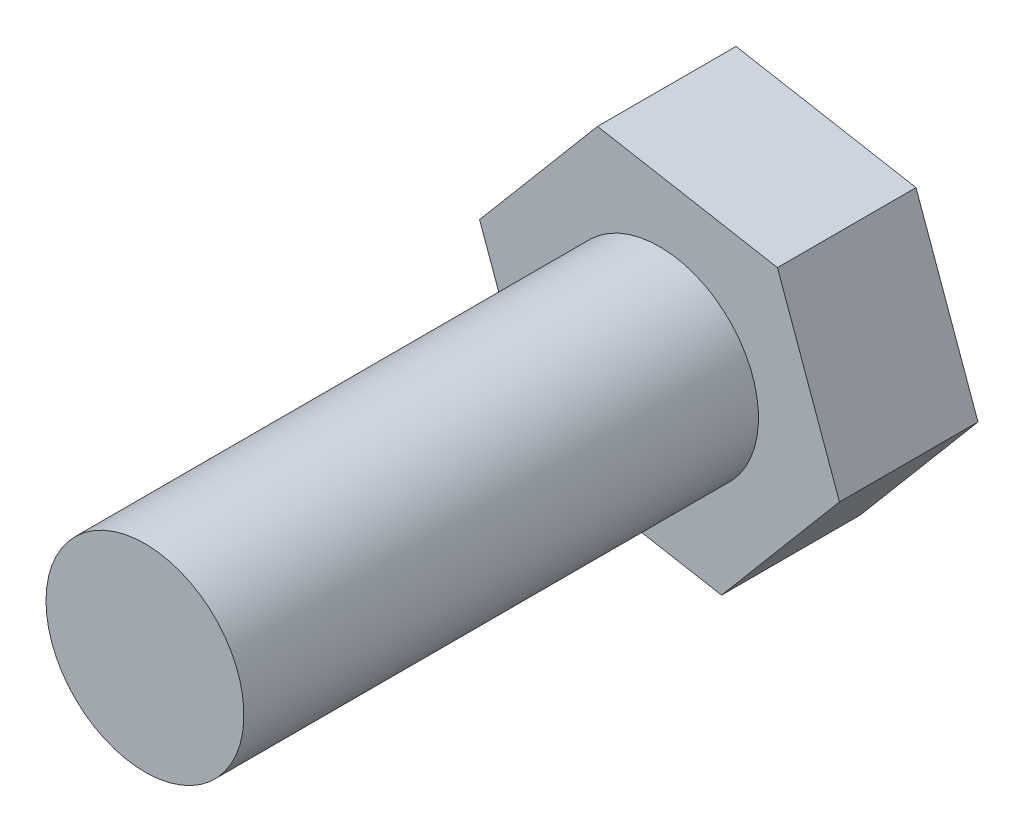
ISO-10303-21;
HEADER;
FILE_DESCRIPTION(('STEP AP214'),'2;1');
FILE_NAME('part.step','',(''),(''),'','','');
FILE_SCHEMA(('AUTOMOTIVE_DESIGN { 1 0 10303 214 1 1 1 1 }'));
ENDSEC;
DATA;
#1=APPLICATION_CONTEXT('core data for automotive mechanical design processes');
#2=APPLICATION_PROTOCOL_DEFINITION('international standard','automotive_design',2000,#1);
#3=PRODUCT_CONTEXT('',#1,'mechanical');
#4=PRODUCT('Part','Part','',(#3));
#5=PRODUCT_RELATED_PRODUCT_CATEGORY('part','',(#4));
#6=PRODUCT_DEFINITION_FORMATION('','',#4);
#7=PRODUCT_DEFINITION_CONTEXT('part definition',#1,'design');
#8=PRODUCT_DEFINITION('design','',#6,#7);
#9=PRODUCT_DEFINITION_SHAPE('','',#8);
#10=(LENGTH_UNIT() NAMED_UNIT(*) SI_UNIT(.MILLI.,.METRE.));
#11=(NAMED_UNIT(*) PLANE_ANGLE_UNIT() SI_UNIT($,.RADIAN.));
#12=(NAMED_UNIT(*) SI_UNIT($,.STERADIAN.) SOLID_ANGLE_UNIT());
#13=UNCERTAINTY_MEASURE_WITH_UNIT(LENGTH_MEASURE(1.E-05),#10,'distance_accuracy_value','');
#14=(GEOMETRIC_REPRESENTATION_CONTEXT(3) GLOBAL_UNCERTAINTY_ASSIGNED_CONTEXT((#13)) GLOBAL_UNIT_ASSIGNED_CONTEXT((#10,
#11,#12)) REPRESENTATION_CONTEXT('',''));
#15=CARTESIAN_POINT('',(0.,0.,0.));
#16=DIRECTION('',(0.,0.,1.));
#17=DIRECTION('',(1.,0.,0.));
#18=AXIS2_PLACEMENT_3D('',#15,#16,#17);
#19=CARTESIAN_POINT('',(0.,0.,3.5));
#20=DIRECTION('',(0.,0.,1.));
#21=DIRECTION('',(1.,0.,0.));
#22=AXIS2_PLACEMENT_3D('',#19,#20,#21);
#23=PLANE('',#22);
#24=DIRECTION('',(0.339123555075527,-0.940741842586443,0.));
#25=VECTOR('',#24,1.);
#26=CARTESIAN_POINT('',(-4.54613967359137,0.816056003918801,3.5));
#27=LINE('',#26,#25);
#28=CARTESIAN_POINT('',(-4.54613967359137,0.816056003918801,3.5));
#29=VERTEX_POINT('',#28);
#30=CARTESIAN_POINT('',(-2.97979506710018,-3.52904444452302,3.5));
#31=VERTEX_POINT('',#30);
#32=EDGE_CURVE('E132',#29,#31,#27,.T.);
#33=ORIENTED_EDGE('',*,*,#32,.T.);
#34=DIRECTION('',(0.984268111620605,-0.176681307576124,0.));
#35=VECTOR('',#34,1.);
#36=CARTESIAN_POINT('',(-2.97979506710018,-3.52904444452302,3.5));
#37=LINE('',#36,#35);
#38=CARTESIAN_POINT('',(1.56634460649119,-4.34510044844182,3.5));
#39=VERTEX_POINT('',#38);
#40=EDGE_CURVE('E90',#31,#39,#37,.T.);
#41=ORIENTED_EDGE('',*,*,#40,.T.);
#42=DIRECTION('',(0.645144556545077,0.764060535010319,0.));
#43=VECTOR('',#42,1.);
#44=CARTESIAN_POINT('',(1.56634460649119,-4.34510044844182,3.5));
#45=LINE('',#44,#43);
#46=CARTESIAN_POINT('',(4.54613967359137,-0.816056003918799,3.5));
#47=VERTEX_POINT('',#46);
#48=EDGE_CURVE('E103',#39,#47,#45,.T.);
#49=ORIENTED_EDGE('',*,*,#48,.T.);
#50=DIRECTION('',(-0.339123555075527,0.940741842586443,0.));
#51=VECTOR('',#50,1.);
#52=CARTESIAN_POINT('',(4.54613967359137,-0.816056003918799,3.5));
#53=LINE('',#52,#51);
#54=CARTESIAN_POINT('',(2.97979506710018,3.52904444452302,3.5));
#55=VERTEX_POINT('',#54);
#56=EDGE_CURVE('E97',#47,#55,#53,.T.);
#57=ORIENTED_EDGE('',*,*,#56,.T.);
#58=DIRECTION('',(-0.984268111620605,0.176681307576124,0.));
#59=VECTOR('',#58,1.);
#60=CARTESIAN_POINT('',(2.97979506710018,3.52904444452302,3.5));
#61=LINE('',#60,#59);
#62=CARTESIAN_POINT('',(-1.56634460649119,4.34510044844182,3.5));
#63=VERTEX_POINT('',#62);
#64=EDGE_CURVE('E101',#55,#63,#61,.T.);
#65=ORIENTED_EDGE('',*,*,#64,.T.);
#66=DIRECTION('',(-0.645144556545078,-0.764060535010319,0.));
#67=VECTOR('',#66,1.);
#68=CARTESIAN_POINT('',(-1.56634460649119,4.34510044844182,3.5));
#69=LINE('',#68,#67);
#70=EDGE_CURVE('E53',#63,#29,#69,.T.);
#71=ORIENTED_EDGE('',*,*,#70,.T.);
#72=EDGE_LOOP('',(#33,#41,#49,#57,#65,#71));
#73=FACE_BOUND('',#72,.T.);
#74=CARTESIAN_POINT('',(0.,0.,3.5));
#75=DIRECTION('',(0.,0.,1.));
#76=DIRECTION('',(1.,0.,0.));
#77=AXIS2_PLACEMENT_3D('',#74,#75,#76);
#78=CIRCLE('',#77,2.5);
#79=CARTESIAN_POINT('',(-2.5,0.,3.5));
#80=VERTEX_POINT('',#79);
#81=EDGE_CURVE('E172',#80,#80,#78,.T.);
#82=ORIENTED_EDGE('',*,*,#81,.F.);
#83=EDGE_LOOP('',(#82));
#84=FACE_BOUND('',#83,.T.);
#85=ADVANCED_FACE('F36',(#73,#84),#23,.T.);
#86=CARTESIAN_POINT('',(-4.54613967359137,0.816056003918801,3.5));
#87=DIRECTION('',(0.940741842586443,0.339123555075527,0.));
#88=DIRECTION('',(-0.339123555075527,0.940741842586443,0.));
#89=AXIS2_PLACEMENT_3D('',#86,#87,#88);
#90=PLANE('',#89);
#91=DIRECTION('',(0.339123555075527,-0.940741842586443,0.));
#92=VECTOR('',#91,1.);
#93=CARTESIAN_POINT('',(-4.54613967359137,0.816056003918801,0.));
#94=LINE('',#93,#92);
#95=CARTESIAN_POINT('',(-4.54613967359137,0.816056003918801,0.));
#96=VERTEX_POINT('',#95);
#97=CARTESIAN_POINT('',(-2.97979506710018,-3.52904444452302,0.));
#98=VERTEX_POINT('',#97);
#99=EDGE_CURVE('E121',#96,#98,#94,.T.);
#100=ORIENTED_EDGE('',*,*,#99,.T.);
#101=DIRECTION('',(0.,0.,-1.));
#102=VECTOR('',#101,1.);
#103=CARTESIAN_POINT('',(-2.97979506710018,-3.52904444452302,3.5));
#104=LINE('',#103,#102);
#105=EDGE_CURVE('E11',#31,#98,#104,.T.);
#106=ORIENTED_EDGE('',*,*,#105,.F.);
#107=ORIENTED_EDGE('',*,*,#32,.F.);
#108=DIRECTION('',(0.,0.,-1.));
#109=VECTOR('',#108,1.);
#110=CARTESIAN_POINT('',(-4.54613967359137,0.816056003918801,3.5));
#111=LINE('',#110,#109);
#112=EDGE_CURVE('E117',#29,#96,#111,.T.);
#113=ORIENTED_EDGE('',*,*,#112,.T.);
#114=EDGE_LOOP('',(#100,#106,#107,#113));
#115=FACE_BOUND('',#114,.T.);
#116=ADVANCED_FACE('F38',(#115),#90,.F.);
#117=CARTESIAN_POINT('',(-2.97979506710018,-3.52904444452302,3.5));
#118=DIRECTION('',(0.176681307576124,0.984268111620605,0.));
#119=DIRECTION('',(-0.984268111620605,0.176681307576124,0.));
#120=AXIS2_PLACEMENT_3D('',#117,#118,#119);
#121=PLANE('',#120);
#122=DIRECTION('',(0.984268111620605,-0.176681307576124,0.));
#123=VECTOR('',#122,1.);
#124=CARTESIAN_POINT('',(-2.97979506710018,-3.52904444452302,0.));
#125=LINE('',#124,#123);
#126=CARTESIAN_POINT('',(1.56634460649119,-4.34510044844182,0.));
#127=VERTEX_POINT('',#126);
#128=EDGE_CURVE('E124',#98,#127,#125,.T.);
#129=ORIENTED_EDGE('',*,*,#128,.T.);
#130=DIRECTION('',(0.,0.,-1.));
#131=VECTOR('',#130,1.);
#132=CARTESIAN_POINT('',(1.56634460649119,-4.34510044844182,3.5));
#133=LINE('',#132,#131);
#134=EDGE_CURVE('E45',#39,#127,#133,.T.);
#135=ORIENTED_EDGE('',*,*,#134,.F.);
#136=ORIENTED_EDGE('',*,*,#40,.F.);
#137=ORIENTED_EDGE('',*,*,#105,.T.);
#138=EDGE_LOOP('',(#129,#135,#136,#137));
#139=FACE_BOUND('',#138,.T.);
#140=ADVANCED_FACE('F160',(#139),#121,.F.);
#141=CARTESIAN_POINT('',(1.56634460649119,-4.34510044844182,3.5));
#142=DIRECTION('',(-0.764060535010319,0.645144556545077,0.));
#143=DIRECTION('',(-0.645144556545078,-0.764060535010319,0.));
#144=AXIS2_PLACEMENT_3D('',#141,#142,#143);
#145=PLANE('',#144);
#146=DIRECTION('',(0.645144556545077,0.764060535010319,0.));
#147=VECTOR('',#146,1.);
#148=CARTESIAN_POINT('',(1.56634460649119,-4.34510044844182,0.));
#149=LINE('',#148,#147);
#150=CARTESIAN_POINT('',(4.54613967359137,-0.816056003918799,0.));
#151=VERTEX_POINT('',#150);
#152=EDGE_CURVE('E127',#127,#151,#149,.T.);
#153=ORIENTED_EDGE('',*,*,#152,.T.);
#154=DIRECTION('',(0.,0.,-1.));
#155=VECTOR('',#154,1.);
#156=CARTESIAN_POINT('',(4.54613967359137,-0.816056003918799,3.5));
#157=LINE('',#156,#155);
#158=EDGE_CURVE('E112',#47,#151,#157,.T.);
#159=ORIENTED_EDGE('',*,*,#158,.F.);
#160=ORIENTED_EDGE('',*,*,#48,.F.);
#161=ORIENTED_EDGE('',*,*,#134,.T.);
#162=EDGE_LOOP('',(#153,#159,#160,#161));
#163=FACE_BOUND('',#162,.T.);
#164=ADVANCED_FACE('F138',(#163),#145,.F.);
#165=CARTESIAN_POINT('',(4.54613967359137,-0.816056003918799,3.5));
#166=DIRECTION('',(-0.940741842586443,-0.339123555075527,0.));
#167=DIRECTION('',(0.339123555075527,-0.940741842586443,0.));
#168=AXIS2_PLACEMENT_3D('',#165,#166,#167);
#169=PLANE('',#168);
#170=DIRECTION('',(-0.339123555075527,0.940741842586443,0.));
#171=VECTOR('',#170,1.);
#172=CARTESIAN_POINT('',(4.54613967359137,-0.816056003918799,0.));
#173=LINE('',#172,#171);
#174=CARTESIAN_POINT('',(2.97979506710018,3.52904444452302,0.));
#175=VERTEX_POINT('',#174);
#176=EDGE_CURVE('E111',#151,#175,#173,.T.);
#177=ORIENTED_EDGE('',*,*,#176,.T.);
#178=DIRECTION('',(0.,0.,-1.));
#179=VECTOR('',#178,1.);
#180=CARTESIAN_POINT('',(2.97979506710018,3.52904444452302,3.5));
#181=LINE('',#180,#179);
#182=EDGE_CURVE('E108',#55,#175,#181,.T.);
#183=ORIENTED_EDGE('',*,*,#182,.F.);
#184=ORIENTED_EDGE('',*,*,#56,.F.);
#185=ORIENTED_EDGE('',*,*,#158,.T.);
#186=EDGE_LOOP('',(#177,#183,#184,#185));
#187=FACE_BOUND('',#186,.T.);
#188=ADVANCED_FACE('F109',(#187),#169,.F.);
#189=CARTESIAN_POINT('',(2.97979506710018,3.52904444452302,3.5));
#190=DIRECTION('',(-0.176681307576124,-0.984268111620605,0.));
#191=DIRECTION('',(0.984268111620605,-0.176681307576124,0.));
#192=AXIS2_PLACEMENT_3D('',#189,#190,#191);
#193=PLANE('',#192);
#194=DIRECTION('',(-0.984268111620605,0.176681307576124,0.));
#195=VECTOR('',#194,1.);
#196=CARTESIAN_POINT('',(2.97979506710018,3.52904444452302,0.));
#197=LINE('',#196,#195);
#198=CARTESIAN_POINT('',(-1.56634460649119,4.34510044844182,0.));
#199=VERTEX_POINT('',#198);
#200=EDGE_CURVE('E76',#175,#199,#197,.T.);
#201=ORIENTED_EDGE('',*,*,#200,.T.);
#202=DIRECTION('',(0.,0.,-1.));
#203=VECTOR('',#202,1.);
#204=CARTESIAN_POINT('',(-1.56634460649119,4.34510044844182,3.5));
#205=LINE('',#204,#203);
#206=EDGE_CURVE('E113',#63,#199,#205,.T.);
#207=ORIENTED_EDGE('',*,*,#206,.F.);
#208=ORIENTED_EDGE('',*,*,#64,.F.);
#209=ORIENTED_EDGE('',*,*,#182,.T.);
#210=EDGE_LOOP('',(#201,#207,#208,#209));
#211=FACE_BOUND('',#210,.T.);
#212=ADVANCED_FACE('F115',(#211),#193,.F.);
#213=CARTESIAN_POINT('',(-1.56634460649119,4.34510044844182,3.5));
#214=DIRECTION('',(0.764060535010319,-0.645144556545077,0.));
#215=DIRECTION('',(0.645144556545078,0.764060535010319,0.));
#216=AXIS2_PLACEMENT_3D('',#213,#214,#215);
#217=PLANE('',#216);
#218=DIRECTION('',(-0.645144556545078,-0.764060535010319,0.));
#219=VECTOR('',#218,1.);
#220=CARTESIAN_POINT('',(-1.56634460649119,4.34510044844182,0.));
#221=LINE('',#220,#219);
#222=EDGE_CURVE('E82',#199,#96,#221,.T.);
#223=ORIENTED_EDGE('',*,*,#222,.T.);
#224=ORIENTED_EDGE('',*,*,#112,.F.);
#225=ORIENTED_EDGE('',*,*,#70,.F.);
#226=ORIENTED_EDGE('',*,*,#206,.T.);
#227=EDGE_LOOP('',(#223,#224,#225,#226));
#228=FACE_BOUND('',#227,.T.);
#229=ADVANCED_FACE('F145',(#228),#217,.F.);
#230=CARTESIAN_POINT('',(0.,0.,0.));
#231=DIRECTION('',(0.,0.,1.));
#232=DIRECTION('',(1.,0.,0.));
#233=AXIS2_PLACEMENT_3D('',#230,#231,#232);
#234=PLANE('',#233);
#235=ORIENTED_EDGE('',*,*,#99,.F.);
#236=ORIENTED_EDGE('',*,*,#222,.F.);
#237=ORIENTED_EDGE('',*,*,#200,.F.);
#238=ORIENTED_EDGE('',*,*,#176,.F.);
#239=ORIENTED_EDGE('',*,*,#152,.F.);
#240=ORIENTED_EDGE('',*,*,#128,.F.);
#241=EDGE_LOOP('',(#235,#236,#237,#238,#239,#240));
#242=FACE_BOUND('',#241,.T.);
#243=ADVANCED_FACE('F141',(#242),#234,.F.);
#244=CARTESIAN_POINT('',(0.,0.,16.5));
#245=DIRECTION('',(0.,0.,-1.));
#246=DIRECTION('',(-1.,0.,0.));
#247=AXIS2_PLACEMENT_3D('',#244,#245,#246);
#248=CYLINDRICAL_SURFACE('',#247,2.5);
#249=CARTESIAN_POINT('',(0.,0.,16.5));
#250=DIRECTION('',(0.,0.,1.));
#251=DIRECTION('',(1.,0.,0.));
#252=AXIS2_PLACEMENT_3D('',#249,#250,#251);
#253=CIRCLE('',#252,2.5);
#254=CARTESIAN_POINT('',(-2.5,0.,16.5));
#255=VERTEX_POINT('',#254);
#256=EDGE_CURVE('E125',#255,#255,#253,.T.);
#257=CARTESIAN_POINT('',(-2.5,0.,16.5));
#258=CARTESIAN_POINT('',(-2.5,0.,16.3645833333333));
#259=CARTESIAN_POINT('',(-2.5,0.,16.2291666666667));
#260=CARTESIAN_POINT('',(-2.5,0.,15.9583333333333));
#261=CARTESIAN_POINT('',(-2.5,0.,15.8229166666667));
#262=CARTESIAN_POINT('',(-2.5,0.,15.5520833333333));
#263=CARTESIAN_POINT('',(-2.5,0.,15.4166666666667));
#264=CARTESIAN_POINT('',(-2.5,0.,15.1458333333333));
#265=CARTESIAN_POINT('',(-2.5,0.,15.0104166666667));
#266=CARTESIAN_POINT('',(-2.5,0.,14.7395833333333));
#267=CARTESIAN_POINT('',(-2.5,0.,14.6041666666667));
#268=CARTESIAN_POINT('',(-2.5,0.,14.3333333333333));
#269=CARTESIAN_POINT('',(-2.5,0.,14.1979166666667));
#270=CARTESIAN_POINT('',(-2.5,0.,13.9270833333333));
#271=CARTESIAN_POINT('',(-2.5,0.,13.7916666666667));
#272=CARTESIAN_POINT('',(-2.5,0.,13.5208333333333));
#273=CARTESIAN_POINT('',(-2.5,0.,13.3854166666667));
#274=CARTESIAN_POINT('',(-2.5,0.,13.1145833333333));
#275=CARTESIAN_POINT('',(-2.5,0.,12.9791666666667));
#276=CARTESIAN_POINT('',(-2.5,0.,12.7083333333333));
#277=CARTESIAN_POINT('',(-2.5,0.,12.5729166666667));
#278=CARTESIAN_POINT('',(-2.5,0.,12.3020833333333));
#279=CARTESIAN_POINT('',(-2.5,0.,12.1666666666667));
#280=CARTESIAN_POINT('',(-2.5,0.,11.8958333333333));
#281=CARTESIAN_POINT('',(-2.5,0.,11.7604166666667));
#282=CARTESIAN_POINT('',(-2.5,0.,11.4895833333333));
#283=CARTESIAN_POINT('',(-2.5,0.,11.3541666666667));
#284=CARTESIAN_POINT('',(-2.5,0.,11.0833333333333));
#285=CARTESIAN_POINT('',(-2.5,0.,10.9479166666667));
#286=CARTESIAN_POINT('',(-2.5,0.,10.6770833333333));
#287=CARTESIAN_POINT('',(-2.5,0.,10.5416666666667));
#288=CARTESIAN_POINT('',(-2.5,0.,10.2708333333333));
#289=CARTESIAN_POINT('',(-2.5,0.,10.1354166666667));
#290=CARTESIAN_POINT('',(-2.5,0.,9.86458333333333));
#291=CARTESIAN_POINT('',(-2.5,0.,9.72916666666667));
#292=CARTESIAN_POINT('',(-2.5,0.,9.45833333333333));
#293=CARTESIAN_POINT('',(-2.5,0.,9.32291666666667));
#294=CARTESIAN_POINT('',(-2.5,0.,9.05208333333333));
#295=CARTESIAN_POINT('',(-2.5,0.,8.91666666666667));
#296=CARTESIAN_POINT('',(-2.5,0.,8.64583333333334));
#297=CARTESIAN_POINT('',(-2.5,0.,8.51041666666667));
#298=CARTESIAN_POINT('',(-2.5,0.,8.23958333333334));
#299=CARTESIAN_POINT('',(-2.5,0.,8.10416666666667));
#300=CARTESIAN_POINT('',(-2.5,0.,7.83333333333333));
#301=CARTESIAN_POINT('',(-2.5,0.,7.69791666666667));
#302=CARTESIAN_POINT('',(-2.5,0.,7.42708333333333));
#303=CARTESIAN_POINT('',(-2.5,0.,7.29166666666667));
#304=CARTESIAN_POINT('',(-2.5,0.,7.02083333333334));
#305=CARTESIAN_POINT('',(-2.5,0.,6.88541666666667));
#306=CARTESIAN_POINT('',(-2.5,0.,6.61458333333334));
#307=CARTESIAN_POINT('',(-2.5,0.,6.47916666666667));
#308=CARTESIAN_POINT('',(-2.5,0.,6.20833333333334));
#309=CARTESIAN_POINT('',(-2.5,0.,6.07291666666667));
#310=CARTESIAN_POINT('',(-2.5,0.,5.80208333333334));
#311=CARTESIAN_POINT('',(-2.5,0.,5.66666666666667));
#312=CARTESIAN_POINT('',(-2.5,0.,5.39583333333333));
#313=CARTESIAN_POINT('',(-2.5,0.,5.26041666666667));
#314=CARTESIAN_POINT('',(-2.5,0.,4.98958333333333));
#315=CARTESIAN_POINT('',(-2.5,0.,4.85416666666667));
#316=CARTESIAN_POINT('',(-2.5,0.,4.58333333333334));
#317=CARTESIAN_POINT('',(-2.5,0.,4.44791666666667));
#318=CARTESIAN_POINT('',(-2.5,0.,4.17708333333334));
#319=CARTESIAN_POINT('',(-2.5,0.,4.04166666666667));
#320=CARTESIAN_POINT('',(-2.5,0.,3.77083333333333));
#321=CARTESIAN_POINT('',(-2.5,0.,3.63541666666667));
#322=CARTESIAN_POINT('',(-2.5,0.,3.5));
#323=B_SPLINE_CURVE_WITH_KNOTS('',3,(#257,#258,#259,#260,#261,#262,#263,#264,#265,#266,#267,
#268,#269,#270,#271,#272,#273,#274,#275,#276,#277,#278,#279,#280,#281,#282,#283,#284,#285,#286,
#287,#288,#289,#290,#291,#292,#293,#294,#295,#296,#297,#298,#299,#300,#301,#302,#303,#304,#305,
#306,#307,#308,#309,#310,#311,#312,#313,#314,#315,#316,#317,#318,#319,#320,#321,#322),
.UNSPECIFIED.,.F.,.F.,(4,2,2,2,2,2,2,2,2,2,2,2,2,2,2,2,2,2,2,2,2,2,2,2,2,2,2,2,2,2,2,2,4),(0.,
0.40625,0.812500000000001,1.21875,1.625,2.03125,2.4375,2.84375,3.25,3.65625,4.0625,4.46875,
4.875,5.28125,5.6875,6.09375,6.5,6.90625,7.3125,7.71875,8.125,8.53125,8.9375,9.34375,9.75,
10.15625,10.5625,10.96875,11.375,11.78125,12.1875,12.59375,13.),.UNSPECIFIED.);
#324=EDGE_CURVE('BSEAM152',#255,#80,#323,.T.);
#325=ORIENTED_EDGE('',*,*,#256,.F.);
#326=ORIENTED_EDGE('',*,*,#81,.T.);
#327=ORIENTED_EDGE('',*,*,#324,.T.);
#328=ORIENTED_EDGE('',*,*,#324,.F.);
#329=EDGE_LOOP('',(#325,#327,#326,#328));
#330=FACE_BOUND('',#329,.T.);
#331=ADVANCED_FACE('F152',(#330),#248,.T.);
#332=CARTESIAN_POINT('',(0.,0.,16.5));
#333=DIRECTION('',(0.,0.,1.));
#334=DIRECTION('',(1.,0.,0.));
#335=AXIS2_PLACEMENT_3D('',#332,#333,#334);
#336=PLANE('',#335);
#337=ORIENTED_EDGE('',*,*,#256,.T.);
#338=EDGE_LOOP('',(#337));
#339=FACE_BOUND('',#338,.T.);
#340=ADVANCED_FACE('F164',(#339),#336,.T.);
#341=CLOSED_SHELL('',(#85,#116,#140,#164,#188,#212,#229,#243,#331,#340));
#342=MANIFOLD_SOLID_BREP('B2',#341);
#343=ADVANCED_BREP_SHAPE_REPRESENTATION('',(#18,#342),#14);
#344=SHAPE_DEFINITION_REPRESENTATION(#9,#343);
ENDSEC;
END-ISO-10303-21;
